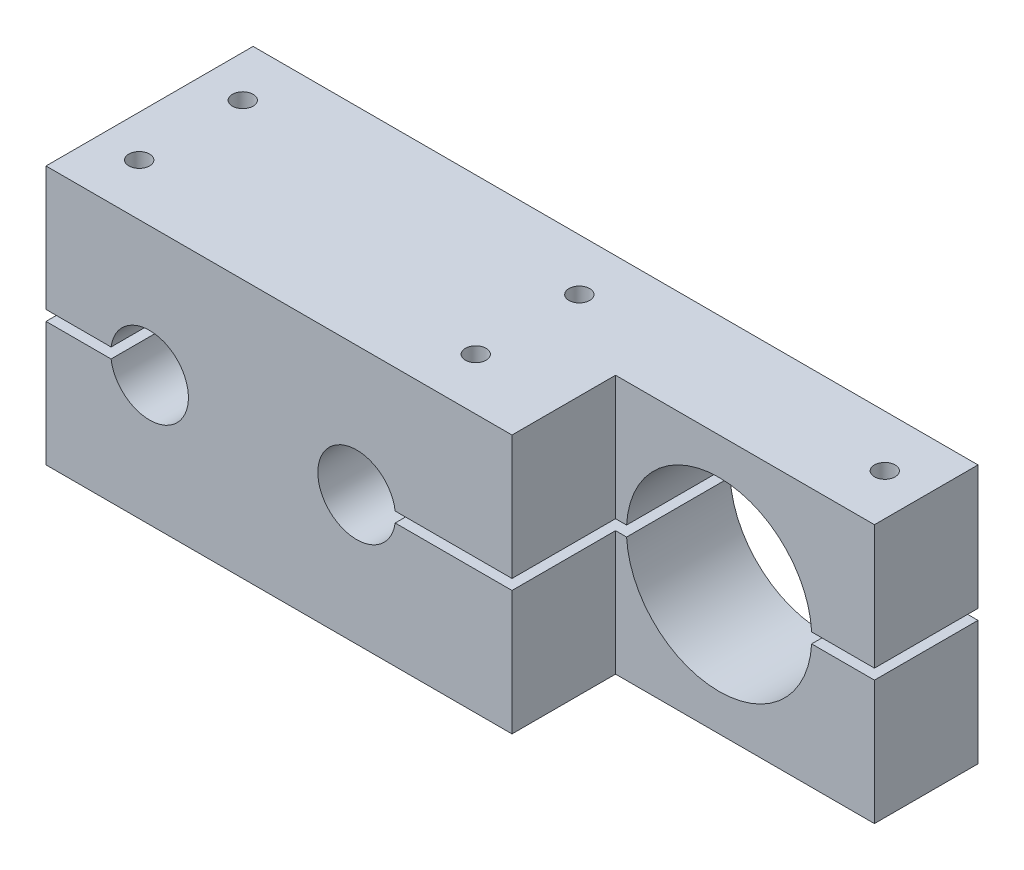
ISO-10303-21;
HEADER;
FILE_DESCRIPTION(('STEP AP214'),'2;1');
FILE_NAME('part.step','',(''),(''),'','','');
FILE_SCHEMA(('AUTOMOTIVE_DESIGN { 1 0 10303 214 1 1 1 1 }'));
ENDSEC;
DATA;
#1=APPLICATION_CONTEXT('core data for automotive mechanical design processes');
#2=APPLICATION_PROTOCOL_DEFINITION('international standard','automotive_design',2000,#1);
#3=PRODUCT_CONTEXT('',#1,'mechanical');
#4=PRODUCT('Part','Part','',(#3));
#5=PRODUCT_RELATED_PRODUCT_CATEGORY('part','',(#4));
#6=PRODUCT_DEFINITION_FORMATION('','',#4);
#7=PRODUCT_DEFINITION_CONTEXT('part definition',#1,'design');
#8=PRODUCT_DEFINITION('design','',#6,#7);
#9=PRODUCT_DEFINITION_SHAPE('','',#8);
#10=(LENGTH_UNIT() NAMED_UNIT(*) SI_UNIT(.MILLI.,.METRE.));
#11=(NAMED_UNIT(*) PLANE_ANGLE_UNIT() SI_UNIT($,.RADIAN.));
#12=(NAMED_UNIT(*) SI_UNIT($,.STERADIAN.) SOLID_ANGLE_UNIT());
#13=UNCERTAINTY_MEASURE_WITH_UNIT(LENGTH_MEASURE(1.E-05),#10,'distance_accuracy_value','');
#14=(GEOMETRIC_REPRESENTATION_CONTEXT(3) GLOBAL_UNCERTAINTY_ASSIGNED_CONTEXT((#13)) GLOBAL_UNIT_ASSIGNED_CONTEXT((#10,
#11,#12)) REPRESENTATION_CONTEXT('',''));
#15=CARTESIAN_POINT('',(0.,0.,0.));
#16=DIRECTION('',(0.,0.,1.));
#17=DIRECTION('',(1.,0.,0.));
#18=AXIS2_PLACEMENT_3D('',#15,#16,#17);
#19=CARTESIAN_POINT('',(0.,0.,40.));
#20=DIRECTION('',(0.,1.,0.));
#21=DIRECTION('',(0.,0.,1.));
#22=AXIS2_PLACEMENT_3D('',#19,#20,#21);
#23=PLANE('',#22);
#24=CARTESIAN_POINT('',(73.,0.,10.));
#25=DIRECTION('',(0.,-1.,0.));
#26=DIRECTION('',(0.,0.,-1.));
#27=AXIS2_PLACEMENT_3D('',#24,#25,#26);
#28=CIRCLE('',#27,2.);
#29=CARTESIAN_POINT('',(73.,0.,8.));
#30=VERTEX_POINT('',#29);
#31=EDGE_CURVE('E532',#30,#30,#28,.T.);
#32=ORIENTED_EDGE('',*,*,#31,.F.);
#33=EDGE_LOOP('',(#32));
#34=FACE_BOUND('',#33,.T.);
#35=CARTESIAN_POINT('',(132.,0.,10.));
#36=DIRECTION('',(0.,-1.,0.));
#37=DIRECTION('',(0.,0.,-1.));
#38=AXIS2_PLACEMENT_3D('',#35,#36,#37);
#39=CIRCLE('',#38,2.);
#40=CARTESIAN_POINT('',(132.,0.,8.00000000000001));
#41=VERTEX_POINT('',#40);
#42=EDGE_CURVE('E245',#41,#41,#39,.T.);
#43=ORIENTED_EDGE('',*,*,#42,.F.);
#44=EDGE_LOOP('',(#43));
#45=FACE_BOUND('',#44,.T.);
#46=CARTESIAN_POINT('',(73.,0.,30.));
#47=DIRECTION('',(0.,-1.,0.));
#48=DIRECTION('',(0.,0.,-1.));
#49=AXIS2_PLACEMENT_3D('',#46,#47,#48);
#50=CIRCLE('',#49,2.);
#51=CARTESIAN_POINT('',(73.,0.,28.));
#52=VERTEX_POINT('',#51);
#53=EDGE_CURVE('E234',#52,#52,#50,.T.);
#54=ORIENTED_EDGE('',*,*,#53,.F.);
#55=EDGE_LOOP('',(#54));
#56=FACE_BOUND('',#55,.T.);
#57=CARTESIAN_POINT('',(8.,0.,30.));
#58=DIRECTION('',(0.,-1.,0.));
#59=DIRECTION('',(0.,0.,-1.));
#60=AXIS2_PLACEMENT_3D('',#57,#58,#59);
#61=CIRCLE('',#60,2.);
#62=CARTESIAN_POINT('',(8.,0.,28.));
#63=VERTEX_POINT('',#62);
#64=EDGE_CURVE('E206',#63,#63,#61,.T.);
#65=ORIENTED_EDGE('',*,*,#64,.F.);
#66=EDGE_LOOP('',(#65));
#67=FACE_BOUND('',#66,.T.);
#68=CARTESIAN_POINT('',(8.,0.,10.));
#69=DIRECTION('',(0.,-1.,0.));
#70=DIRECTION('',(0.,0.,-1.));
#71=AXIS2_PLACEMENT_3D('',#68,#69,#70);
#72=CIRCLE('',#71,2.);
#73=CARTESIAN_POINT('',(8.,0.,8.));
#74=VERTEX_POINT('',#73);
#75=EDGE_CURVE('E210',#74,#74,#72,.T.);
#76=ORIENTED_EDGE('',*,*,#75,.F.);
#77=EDGE_LOOP('',(#76));
#78=FACE_BOUND('',#77,.T.);
#79=DIRECTION('',(-1.,0.,0.));
#80=VECTOR('',#79,1.);
#81=CARTESIAN_POINT('',(140.,0.,20.));
#82=LINE('',#81,#80);
#83=CARTESIAN_POINT('',(140.,0.,20.));
#84=VERTEX_POINT('',#83);
#85=CARTESIAN_POINT('',(90.,0.,20.));
#86=VERTEX_POINT('',#85);
#87=EDGE_CURVE('E172',#84,#86,#82,.T.);
#88=ORIENTED_EDGE('',*,*,#87,.T.);
#89=DIRECTION('',(0.,0.,1.));
#90=VECTOR('',#89,1.);
#91=CARTESIAN_POINT('',(90.,0.,20.));
#92=LINE('',#91,#90);
#93=CARTESIAN_POINT('',(90.,0.,40.));
#94=VERTEX_POINT('',#93);
#95=EDGE_CURVE('E182',#86,#94,#92,.T.);
#96=ORIENTED_EDGE('',*,*,#95,.T.);
#97=DIRECTION('',(1.,0.,0.));
#98=VECTOR('',#97,1.);
#99=CARTESIAN_POINT('',(0.,0.,40.));
#100=LINE('',#99,#98);
#101=CARTESIAN_POINT('',(0.,0.,40.));
#102=VERTEX_POINT('',#101);
#103=EDGE_CURVE('E261',#102,#94,#100,.T.);
#104=ORIENTED_EDGE('',*,*,#103,.F.);
#105=DIRECTION('',(0.,0.,-1.));
#106=VECTOR('',#105,1.);
#107=CARTESIAN_POINT('',(0.,0.,40.));
#108=LINE('',#107,#106);
#109=CARTESIAN_POINT('',(0.,0.,0.));
#110=VERTEX_POINT('',#109);
#111=EDGE_CURVE('E43',#102,#110,#108,.T.);
#112=ORIENTED_EDGE('',*,*,#111,.T.);
#113=DIRECTION('',(1.,0.,0.));
#114=VECTOR('',#113,1.);
#115=CARTESIAN_POINT('',(0.,0.,0.));
#116=LINE('',#115,#114);
#117=CARTESIAN_POINT('',(140.,0.,0.));
#118=VERTEX_POINT('',#117);
#119=EDGE_CURVE('E195',#110,#118,#116,.T.);
#120=ORIENTED_EDGE('',*,*,#119,.T.);
#121=DIRECTION('',(0.,0.,-1.));
#122=VECTOR('',#121,1.);
#123=CARTESIAN_POINT('',(140.,0.,40.));
#124=LINE('',#123,#122);
#125=EDGE_CURVE('E188',#84,#118,#124,.T.);
#126=ORIENTED_EDGE('',*,*,#125,.F.);
#127=EDGE_LOOP('',(#88,#96,#104,#112,#120,#126));
#128=FACE_BOUND('',#127,.T.);
#129=ADVANCED_FACE('F35',(#34,#45,#56,#67,#78,#128),#23,.F.);
#130=CARTESIAN_POINT('',(140.,23.9990958261087,40.));
#131=DIRECTION('',(-1.,0.,0.));
#132=DIRECTION('',(0.,0.,1.));
#133=AXIS2_PLACEMENT_3D('',#130,#131,#132);
#134=PLANE('',#133);
#135=DIRECTION('',(0.,-1.,0.));
#136=VECTOR('',#135,1.);
#137=CARTESIAN_POINT('',(140.,50.,20.));
#138=LINE('',#137,#136);
#139=CARTESIAN_POINT('',(140.,23.9990958261087,20.));
#140=VERTEX_POINT('',#139);
#141=EDGE_CURVE('E175',#140,#84,#138,.T.);
#142=ORIENTED_EDGE('',*,*,#141,.T.);
#143=ORIENTED_EDGE('',*,*,#125,.T.);
#144=DIRECTION('',(0.,1.,0.));
#145=VECTOR('',#144,1.);
#146=CARTESIAN_POINT('',(140.,23.9990958261087,0.));
#147=LINE('',#146,#145);
#148=CARTESIAN_POINT('',(140.,23.9990958261087,0.));
#149=VERTEX_POINT('',#148);
#150=EDGE_CURVE('E286',#118,#149,#147,.T.);
#151=ORIENTED_EDGE('',*,*,#150,.T.);
#152=DIRECTION('',(0.,0.,-1.));
#153=VECTOR('',#152,1.);
#154=CARTESIAN_POINT('',(140.,23.9990958261087,40.));
#155=LINE('',#154,#153);
#156=EDGE_CURVE('E190',#140,#149,#155,.T.);
#157=ORIENTED_EDGE('',*,*,#156,.F.);
#158=EDGE_LOOP('',(#142,#143,#151,#157));
#159=FACE_BOUND('',#158,.T.);
#160=ADVANCED_FACE('F186',(#159),#134,.F.);
#161=CARTESIAN_POINT('',(127.871994595867,23.9990958261087,40.));
#162=DIRECTION('',(0.,-1.,0.));
#163=DIRECTION('',(1.,0.,0.));
#164=AXIS2_PLACEMENT_3D('',#161,#162,#163);
#165=PLANE('',#164);
#166=CARTESIAN_POINT('',(132.,23.9990958261087,10.));
#167=DIRECTION('',(0.,-1.,0.));
#168=DIRECTION('',(1.,0.,0.));
#169=AXIS2_PLACEMENT_3D('',#166,#167,#168);
#170=CIRCLE('',#169,2.);
#171=CARTESIAN_POINT('',(134.,23.9990958261087,10.));
#172=VERTEX_POINT('',#171);
#173=EDGE_CURVE('E254',#172,#172,#170,.T.);
#174=ORIENTED_EDGE('',*,*,#173,.T.);
#175=EDGE_LOOP('',(#174));
#176=FACE_BOUND('',#175,.T.);
#177=DIRECTION('',(-1.,0.,0.));
#178=VECTOR('',#177,1.);
#179=CARTESIAN_POINT('',(127.871994595867,23.9990958261087,20.));
#180=LINE('',#179,#178);
#181=CARTESIAN_POINT('',(127.871994595867,23.9990958261087,20.));
#182=VERTEX_POINT('',#181);
#183=EDGE_CURVE('E222',#140,#182,#180,.T.);
#184=ORIENTED_EDGE('',*,*,#183,.F.);
#185=ORIENTED_EDGE('',*,*,#156,.T.);
#186=DIRECTION('',(-1.,0.,0.));
#187=VECTOR('',#186,1.);
#188=CARTESIAN_POINT('',(127.871994595867,23.9990958261087,0.));
#189=LINE('',#188,#187);
#190=CARTESIAN_POINT('',(127.871994595867,23.9990958261087,0.));
#191=VERTEX_POINT('',#190);
#192=EDGE_CURVE('E288',#149,#191,#189,.T.);
#193=ORIENTED_EDGE('',*,*,#192,.T.);
#194=DIRECTION('',(0.,0.,-1.));
#195=VECTOR('',#194,1.);
#196=CARTESIAN_POINT('',(127.871994595867,23.9990958261087,40.));
#197=LINE('',#196,#195);
#198=EDGE_CURVE('E199',#182,#191,#197,.T.);
#199=ORIENTED_EDGE('',*,*,#198,.F.);
#200=EDGE_LOOP('',(#184,#185,#193,#199));
#201=FACE_BOUND('',#200,.T.);
#202=ADVANCED_FACE('F358',(#176,#201),#165,.F.);
#203=CARTESIAN_POINT('',(110.,25.,40.));
#204=DIRECTION('',(0.,0.,-1.));
#205=DIRECTION('',(-1.,0.,0.));
#206=AXIS2_PLACEMENT_3D('',#203,#204,#205);
#207=CYLINDRICAL_SURFACE('',#206,17.9);
#208=CARTESIAN_POINT('',(110.,25.,20.));
#209=DIRECTION('',(0.,0.,1.));
#210=DIRECTION('',(1.,0.,0.));
#211=AXIS2_PLACEMENT_3D('',#208,#209,#210);
#212=CIRCLE('',#211,17.9);
#213=CARTESIAN_POINT('',(92.1280054041333,23.9990958261087,20.));
#214=VERTEX_POINT('',#213);
#215=EDGE_CURVE('E355',#182,#214,#212,.F.);
#216=ORIENTED_EDGE('',*,*,#215,.F.);
#217=ORIENTED_EDGE('',*,*,#198,.T.);
#218=CARTESIAN_POINT('',(110.,25.,0.));
#219=DIRECTION('',(0.,0.,-1.));
#220=DIRECTION('',(1.,0.,0.));
#221=AXIS2_PLACEMENT_3D('',#218,#219,#220);
#222=CIRCLE('',#221,17.9);
#223=CARTESIAN_POINT('',(92.1280054041333,23.9990958261087,0.));
#224=VERTEX_POINT('',#223);
#225=EDGE_CURVE('E291',#191,#224,#222,.T.);
#226=ORIENTED_EDGE('',*,*,#225,.T.);
#227=DIRECTION('',(0.,0.,-1.));
#228=VECTOR('',#227,1.);
#229=CARTESIAN_POINT('',(92.1280054041333,23.9990958261087,40.));
#230=LINE('',#229,#228);
#231=EDGE_CURVE('E347',#214,#224,#230,.T.);
#232=ORIENTED_EDGE('',*,*,#231,.F.);
#233=EDGE_LOOP('',(#216,#217,#226,#232));
#234=FACE_BOUND('',#233,.T.);
#235=ADVANCED_FACE('F351',(#234),#207,.F.);
#236=CARTESIAN_POINT('',(67.4329126750344,23.9990958261087,40.));
#237=DIRECTION('',(0.,-1.,0.));
#238=DIRECTION('',(1.,0.,0.));
#239=AXIS2_PLACEMENT_3D('',#236,#237,#238);
#240=PLANE('',#239);
#241=CARTESIAN_POINT('',(73.,23.9990958261087,10.));
#242=DIRECTION('',(0.,-1.,0.));
#243=DIRECTION('',(1.,0.,0.));
#244=AXIS2_PLACEMENT_3D('',#241,#242,#243);
#245=CIRCLE('',#244,2.);
#246=CARTESIAN_POINT('',(75.,23.9990958261087,10.));
#247=VERTEX_POINT('',#246);
#248=EDGE_CURVE('E192',#247,#247,#245,.T.);
#249=ORIENTED_EDGE('',*,*,#248,.T.);
#250=EDGE_LOOP('',(#249));
#251=FACE_BOUND('',#250,.T.);
#252=CARTESIAN_POINT('',(73.,23.9990958261087,30.));
#253=DIRECTION('',(0.,-1.,0.));
#254=DIRECTION('',(1.,0.,0.));
#255=AXIS2_PLACEMENT_3D('',#252,#253,#254);
#256=CIRCLE('',#255,2.);
#257=CARTESIAN_POINT('',(75.,23.9990958261087,30.));
#258=VERTEX_POINT('',#257);
#259=EDGE_CURVE('E242',#258,#258,#256,.T.);
#260=ORIENTED_EDGE('',*,*,#259,.T.);
#261=EDGE_LOOP('',(#260));
#262=FACE_BOUND('',#261,.T.);
#263=DIRECTION('',(-1.,0.,0.));
#264=VECTOR('',#263,1.);
#265=CARTESIAN_POINT('',(67.4329126750344,23.9990958261087,20.));
#266=LINE('',#265,#264);
#267=CARTESIAN_POINT('',(90.,23.9990958261087,20.));
#268=VERTEX_POINT('',#267);
#269=EDGE_CURVE('E376',#214,#268,#266,.T.);
#270=ORIENTED_EDGE('',*,*,#269,.F.);
#271=ORIENTED_EDGE('',*,*,#231,.T.);
#272=DIRECTION('',(-1.,0.,0.));
#273=VECTOR('',#272,1.);
#274=CARTESIAN_POINT('',(67.4329126750344,23.9990958261087,0.));
#275=LINE('',#274,#273);
#276=CARTESIAN_POINT('',(67.4329126750344,23.9990958261087,0.));
#277=VERTEX_POINT('',#276);
#278=EDGE_CURVE('E294',#224,#277,#275,.T.);
#279=ORIENTED_EDGE('',*,*,#278,.T.);
#280=DIRECTION('',(0.,0.,-1.));
#281=VECTOR('',#280,1.);
#282=CARTESIAN_POINT('',(67.4329126750344,23.9990958261087,40.));
#283=LINE('',#282,#281);
#284=CARTESIAN_POINT('',(67.4329126750344,23.9990958261087,40.));
#285=VERTEX_POINT('',#284);
#286=EDGE_CURVE('E344',#285,#277,#283,.T.);
#287=ORIENTED_EDGE('',*,*,#286,.F.);
#288=DIRECTION('',(-1.,0.,0.));
#289=VECTOR('',#288,1.);
#290=CARTESIAN_POINT('',(67.4329126750344,23.9990958261087,40.));
#291=LINE('',#290,#289);
#292=CARTESIAN_POINT('',(90.,23.9990958261087,40.));
#293=VERTEX_POINT('',#292);
#294=EDGE_CURVE('E265',#293,#285,#291,.T.);
#295=ORIENTED_EDGE('',*,*,#294,.F.);
#296=DIRECTION('',(0.,0.,1.));
#297=VECTOR('',#296,1.);
#298=CARTESIAN_POINT('',(90.,23.9990958261087,40.));
#299=LINE('',#298,#297);
#300=EDGE_CURVE('E58',#268,#293,#299,.T.);
#301=ORIENTED_EDGE('',*,*,#300,.F.);
#302=EDGE_LOOP('',(#270,#271,#279,#287,#295,#301));
#303=FACE_BOUND('',#302,.T.);
#304=ADVANCED_FACE('F367',(#251,#262,#303),#240,.F.);
#305=CARTESIAN_POINT('',(67.4329126750344,26.0009041738913,40.));
#306=DIRECTION('',(0.,1.,0.));
#307=DIRECTION('',(-1.,0.,0.));
#308=AXIS2_PLACEMENT_3D('',#305,#306,#307);
#309=PLANE('',#308);
#310=CARTESIAN_POINT('',(73.,26.0009041738913,10.));
#311=DIRECTION('',(0.,1.,0.));
#312=DIRECTION('',(-1.,0.,0.));
#313=AXIS2_PLACEMENT_3D('',#310,#311,#312);
#314=CIRCLE('',#313,2.);
#315=CARTESIAN_POINT('',(71.,26.0009041738913,10.));
#316=VERTEX_POINT('',#315);
#317=EDGE_CURVE('E535',#316,#316,#314,.T.);
#318=ORIENTED_EDGE('',*,*,#317,.T.);
#319=EDGE_LOOP('',(#318));
#320=FACE_BOUND('',#319,.T.);
#321=CARTESIAN_POINT('',(73.,26.0009041738913,30.));
#322=DIRECTION('',(0.,1.,0.));
#323=DIRECTION('',(-1.,0.,0.));
#324=AXIS2_PLACEMENT_3D('',#321,#322,#323);
#325=CIRCLE('',#324,2.);
#326=CARTESIAN_POINT('',(71.,26.0009041738913,30.));
#327=VERTEX_POINT('',#326);
#328=EDGE_CURVE('E237',#327,#327,#325,.T.);
#329=ORIENTED_EDGE('',*,*,#328,.T.);
#330=EDGE_LOOP('',(#329));
#331=FACE_BOUND('',#330,.T.);
#332=DIRECTION('',(1.,0.,0.));
#333=VECTOR('',#332,1.);
#334=CARTESIAN_POINT('',(67.4329126750344,26.0009041738913,20.));
#335=LINE('',#334,#333);
#336=CARTESIAN_POINT('',(90.,26.0009041738913,20.));
#337=VERTEX_POINT('',#336);
#338=CARTESIAN_POINT('',(92.1280054041333,26.0009041738913,20.));
#339=VERTEX_POINT('',#338);
#340=EDGE_CURVE('E386',#337,#339,#335,.T.);
#341=ORIENTED_EDGE('',*,*,#340,.F.);
#342=DIRECTION('',(0.,0.,-1.));
#343=VECTOR('',#342,1.);
#344=CARTESIAN_POINT('',(90.,26.0009041738913,40.));
#345=LINE('',#344,#343);
#346=CARTESIAN_POINT('',(90.,26.0009041738913,40.));
#347=VERTEX_POINT('',#346);
#348=EDGE_CURVE('E378',#347,#337,#345,.T.);
#349=ORIENTED_EDGE('',*,*,#348,.F.);
#350=DIRECTION('',(1.,0.,0.));
#351=VECTOR('',#350,1.);
#352=CARTESIAN_POINT('',(67.4329126750344,26.0009041738913,40.));
#353=LINE('',#352,#351);
#354=CARTESIAN_POINT('',(67.4329126750344,26.0009041738913,40.));
#355=VERTEX_POINT('',#354);
#356=EDGE_CURVE('E269',#355,#347,#353,.T.);
#357=ORIENTED_EDGE('',*,*,#356,.F.);
#358=DIRECTION('',(0.,0.,-1.));
#359=VECTOR('',#358,1.);
#360=CARTESIAN_POINT('',(67.4329126750344,26.0009041738913,40.));
#361=LINE('',#360,#359);
#362=CARTESIAN_POINT('',(67.4329126750344,26.0009041738913,0.));
#363=VERTEX_POINT('',#362);
#364=EDGE_CURVE('E341',#355,#363,#361,.T.);
#365=ORIENTED_EDGE('',*,*,#364,.T.);
#366=DIRECTION('',(1.,0.,0.));
#367=VECTOR('',#366,1.);
#368=CARTESIAN_POINT('',(67.4329126750344,26.0009041738913,0.));
#369=LINE('',#368,#367);
#370=CARTESIAN_POINT('',(92.1280054041333,26.0009041738913,0.));
#371=VERTEX_POINT('',#370);
#372=EDGE_CURVE('E298',#363,#371,#369,.T.);
#373=ORIENTED_EDGE('',*,*,#372,.T.);
#374=DIRECTION('',(0.,0.,-1.));
#375=VECTOR('',#374,1.);
#376=CARTESIAN_POINT('',(92.1280054041333,26.0009041738913,40.));
#377=LINE('',#376,#375);
#378=EDGE_CURVE('E339',#339,#371,#377,.T.);
#379=ORIENTED_EDGE('',*,*,#378,.F.);
#380=EDGE_LOOP('',(#341,#349,#357,#365,#373,#379));
#381=FACE_BOUND('',#380,.T.);
#382=ADVANCED_FACE('F406',(#320,#331,#381),#309,.F.);
#383=CARTESIAN_POINT('',(110.,25.,40.));
#384=DIRECTION('',(0.,0.,-1.));
#385=DIRECTION('',(-1.,0.,0.));
#386=AXIS2_PLACEMENT_3D('',#383,#384,#385);
#387=CYLINDRICAL_SURFACE('',#386,17.9);
#388=CARTESIAN_POINT('',(110.,25.,20.));
#389=DIRECTION('',(0.,0.,1.));
#390=DIRECTION('',(1.,0.,0.));
#391=AXIS2_PLACEMENT_3D('',#388,#389,#390);
#392=CIRCLE('',#391,17.9);
#393=CARTESIAN_POINT('',(127.871994595867,26.0009041738913,20.));
#394=VERTEX_POINT('',#393);
#395=EDGE_CURVE('E380',#339,#394,#392,.F.);
#396=ORIENTED_EDGE('',*,*,#395,.F.);
#397=ORIENTED_EDGE('',*,*,#378,.T.);
#398=CARTESIAN_POINT('',(110.,25.,0.));
#399=DIRECTION('',(0.,0.,-1.));
#400=DIRECTION('',(1.,0.,0.));
#401=AXIS2_PLACEMENT_3D('',#398,#399,#400);
#402=CIRCLE('',#401,17.9);
#403=CARTESIAN_POINT('',(127.871994595867,26.0009041738913,0.));
#404=VERTEX_POINT('',#403);
#405=EDGE_CURVE('E301',#371,#404,#402,.T.);
#406=ORIENTED_EDGE('',*,*,#405,.T.);
#407=DIRECTION('',(0.,0.,-1.));
#408=VECTOR('',#407,1.);
#409=CARTESIAN_POINT('',(127.871994595867,26.0009041738913,40.));
#410=LINE('',#409,#408);
#411=EDGE_CURVE('E337',#394,#404,#410,.T.);
#412=ORIENTED_EDGE('',*,*,#411,.F.);
#413=EDGE_LOOP('',(#396,#397,#406,#412));
#414=FACE_BOUND('',#413,.T.);
#415=ADVANCED_FACE('F413',(#414),#387,.F.);
#416=CARTESIAN_POINT('',(127.871994595867,26.0009041738913,40.));
#417=DIRECTION('',(0.,1.,0.));
#418=DIRECTION('',(-1.,0.,0.));
#419=AXIS2_PLACEMENT_3D('',#416,#417,#418);
#420=PLANE('',#419);
#421=CARTESIAN_POINT('',(132.,26.0009041738913,10.));
#422=DIRECTION('',(0.,1.,0.));
#423=DIRECTION('',(-1.,0.,0.));
#424=AXIS2_PLACEMENT_3D('',#421,#422,#423);
#425=CIRCLE('',#424,2.);
#426=CARTESIAN_POINT('',(130.,26.0009041738913,10.));
#427=VERTEX_POINT('',#426);
#428=EDGE_CURVE('E249',#427,#427,#425,.T.);
#429=ORIENTED_EDGE('',*,*,#428,.T.);
#430=EDGE_LOOP('',(#429));
#431=FACE_BOUND('',#430,.T.);
#432=DIRECTION('',(1.,0.,0.));
#433=VECTOR('',#432,1.);
#434=CARTESIAN_POINT('',(127.871994595867,26.0009041738913,20.));
#435=LINE('',#434,#433);
#436=CARTESIAN_POINT('',(140.,26.0009041738913,20.));
#437=VERTEX_POINT('',#436);
#438=EDGE_CURVE('E377',#394,#437,#435,.T.);
#439=ORIENTED_EDGE('',*,*,#438,.F.);
#440=ORIENTED_EDGE('',*,*,#411,.T.);
#441=DIRECTION('',(1.,0.,0.));
#442=VECTOR('',#441,1.);
#443=CARTESIAN_POINT('',(127.871994595867,26.0009041738913,0.));
#444=LINE('',#443,#442);
#445=CARTESIAN_POINT('',(140.,26.0009041738913,0.));
#446=VERTEX_POINT('',#445);
#447=EDGE_CURVE('E304',#404,#446,#444,.T.);
#448=ORIENTED_EDGE('',*,*,#447,.T.);
#449=DIRECTION('',(0.,0.,-1.));
#450=VECTOR('',#449,1.);
#451=CARTESIAN_POINT('',(140.,26.0009041738913,40.));
#452=LINE('',#451,#450);
#453=EDGE_CURVE('E335',#437,#446,#452,.T.);
#454=ORIENTED_EDGE('',*,*,#453,.F.);
#455=EDGE_LOOP('',(#439,#440,#448,#454));
#456=FACE_BOUND('',#455,.T.);
#457=ADVANCED_FACE('F417',(#431,#456),#420,.F.);
#458=CARTESIAN_POINT('',(140.,50.,40.));
#459=DIRECTION('',(-1.,0.,0.));
#460=DIRECTION('',(0.,0.,1.));
#461=AXIS2_PLACEMENT_3D('',#458,#459,#460);
#462=PLANE('',#461);
#463=CARTESIAN_POINT('',(140.,50.,20.));
#464=VERTEX_POINT('',#463);
#465=EDGE_CURVE('E191',#464,#437,#138,.T.);
#466=ORIENTED_EDGE('',*,*,#465,.T.);
#467=ORIENTED_EDGE('',*,*,#453,.T.);
#468=DIRECTION('',(0.,1.,0.));
#469=VECTOR('',#468,1.);
#470=CARTESIAN_POINT('',(140.,50.,0.));
#471=LINE('',#470,#469);
#472=CARTESIAN_POINT('',(140.,50.,0.));
#473=VERTEX_POINT('',#472);
#474=EDGE_CURVE('E307',#446,#473,#471,.T.);
#475=ORIENTED_EDGE('',*,*,#474,.T.);
#476=DIRECTION('',(0.,0.,-1.));
#477=VECTOR('',#476,1.);
#478=CARTESIAN_POINT('',(140.,50.,40.));
#479=LINE('',#478,#477);
#480=EDGE_CURVE('E333',#464,#473,#479,.T.);
#481=ORIENTED_EDGE('',*,*,#480,.F.);
#482=EDGE_LOOP('',(#466,#467,#475,#481));
#483=FACE_BOUND('',#482,.T.);
#484=ADVANCED_FACE('F422',(#483),#462,.F.);
#485=CARTESIAN_POINT('',(0.,50.,40.));
#486=DIRECTION('',(0.,-1.,0.));
#487=DIRECTION('',(0.,0.,-1.));
#488=AXIS2_PLACEMENT_3D('',#485,#486,#487);
#489=PLANE('',#488);
#490=CARTESIAN_POINT('',(73.,50.,10.));
#491=DIRECTION('',(0.,-1.,0.));
#492=DIRECTION('',(0.,0.,-1.));
#493=AXIS2_PLACEMENT_3D('',#490,#491,#492);
#494=CIRCLE('',#493,2.);
#495=CARTESIAN_POINT('',(73.,50.,8.));
#496=VERTEX_POINT('',#495);
#497=EDGE_CURVE('E539',#496,#496,#494,.T.);
#498=ORIENTED_EDGE('',*,*,#497,.T.);
#499=EDGE_LOOP('',(#498));
#500=FACE_BOUND('',#499,.T.);
#501=CARTESIAN_POINT('',(132.,50.,10.));
#502=DIRECTION('',(0.,-1.,0.));
#503=DIRECTION('',(0.,0.,-1.));
#504=AXIS2_PLACEMENT_3D('',#501,#502,#503);
#505=CIRCLE('',#504,2.);
#506=CARTESIAN_POINT('',(132.,50.,8.00000000000001));
#507=VERTEX_POINT('',#506);
#508=EDGE_CURVE('E246',#507,#507,#505,.T.);
#509=ORIENTED_EDGE('',*,*,#508,.T.);
#510=EDGE_LOOP('',(#509));
#511=FACE_BOUND('',#510,.T.);
#512=CARTESIAN_POINT('',(73.,50.,30.));
#513=DIRECTION('',(0.,-1.,0.));
#514=DIRECTION('',(0.,0.,-1.));
#515=AXIS2_PLACEMENT_3D('',#512,#513,#514);
#516=CIRCLE('',#515,2.);
#517=CARTESIAN_POINT('',(73.,50.,28.));
#518=VERTEX_POINT('',#517);
#519=EDGE_CURVE('E233',#518,#518,#516,.T.);
#520=ORIENTED_EDGE('',*,*,#519,.T.);
#521=EDGE_LOOP('',(#520));
#522=FACE_BOUND('',#521,.T.);
#523=CARTESIAN_POINT('',(8.,50.,30.));
#524=DIRECTION('',(0.,-1.,0.));
#525=DIRECTION('',(0.,0.,-1.));
#526=AXIS2_PLACEMENT_3D('',#523,#524,#525);
#527=CIRCLE('',#526,2.);
#528=CARTESIAN_POINT('',(8.,50.,28.));
#529=VERTEX_POINT('',#528);
#530=EDGE_CURVE('E214',#529,#529,#527,.T.);
#531=ORIENTED_EDGE('',*,*,#530,.T.);
#532=EDGE_LOOP('',(#531));
#533=FACE_BOUND('',#532,.T.);
#534=CARTESIAN_POINT('',(8.,50.,10.));
#535=DIRECTION('',(0.,-1.,0.));
#536=DIRECTION('',(0.,0.,-1.));
#537=AXIS2_PLACEMENT_3D('',#534,#535,#536);
#538=CIRCLE('',#537,2.);
#539=CARTESIAN_POINT('',(8.,50.,8.));
#540=VERTEX_POINT('',#539);
#541=EDGE_CURVE('E217',#540,#540,#538,.T.);
#542=ORIENTED_EDGE('',*,*,#541,.T.);
#543=EDGE_LOOP('',(#542));
#544=FACE_BOUND('',#543,.T.);
#545=DIRECTION('',(-1.,0.,0.));
#546=VECTOR('',#545,1.);
#547=CARTESIAN_POINT('',(140.,50.,20.));
#548=LINE('',#547,#546);
#549=CARTESIAN_POINT('',(90.,50.,20.));
#550=VERTEX_POINT('',#549);
#551=EDGE_CURVE('E398',#464,#550,#548,.T.);
#552=ORIENTED_EDGE('',*,*,#551,.F.);
#553=ORIENTED_EDGE('',*,*,#480,.T.);
#554=DIRECTION('',(-1.,0.,0.));
#555=VECTOR('',#554,1.);
#556=CARTESIAN_POINT('',(0.,50.,0.));
#557=LINE('',#556,#555);
#558=CARTESIAN_POINT('',(0.,50.,0.));
#559=VERTEX_POINT('',#558);
#560=EDGE_CURVE('E310',#473,#559,#557,.T.);
#561=ORIENTED_EDGE('',*,*,#560,.T.);
#562=DIRECTION('',(0.,0.,-1.));
#563=VECTOR('',#562,1.);
#564=CARTESIAN_POINT('',(0.,50.,40.));
#565=LINE('',#564,#563);
#566=CARTESIAN_POINT('',(0.,50.,40.));
#567=VERTEX_POINT('',#566);
#568=EDGE_CURVE('E330',#567,#559,#565,.T.);
#569=ORIENTED_EDGE('',*,*,#568,.F.);
#570=DIRECTION('',(-1.,0.,0.));
#571=VECTOR('',#570,1.);
#572=CARTESIAN_POINT('',(0.,50.,40.));
#573=LINE('',#572,#571);
#574=CARTESIAN_POINT('',(90.,50.,40.));
#575=VERTEX_POINT('',#574);
#576=EDGE_CURVE('E272',#575,#567,#573,.T.);
#577=ORIENTED_EDGE('',*,*,#576,.F.);
#578=DIRECTION('',(0.,0.,1.));
#579=VECTOR('',#578,1.);
#580=CARTESIAN_POINT('',(90.,50.,20.));
#581=LINE('',#580,#579);
#582=EDGE_CURVE('E50',#550,#575,#581,.T.);
#583=ORIENTED_EDGE('',*,*,#582,.F.);
#584=EDGE_LOOP('',(#552,#553,#561,#569,#577,#583));
#585=FACE_BOUND('',#584,.T.);
#586=ADVANCED_FACE('F425',(#500,#511,#522,#533,#544,#585),#489,.F.);
#587=CARTESIAN_POINT('',(20.,25.,40.));
#588=DIRECTION('',(0.,0.,1.));
#589=DIRECTION('',(1.,0.,0.));
#590=AXIS2_PLACEMENT_3D('',#587,#588,#589);
#591=PLANE('',#590);
#592=ORIENTED_EDGE('',*,*,#103,.T.);
#593=DIRECTION('',(0.,1.,0.));
#594=VECTOR('',#593,1.);
#595=CARTESIAN_POINT('',(90.,25.,40.));
#596=LINE('',#595,#594);
#597=EDGE_CURVE('E11',#94,#293,#596,.T.);
#598=ORIENTED_EDGE('',*,*,#597,.T.);
#599=ORIENTED_EDGE('',*,*,#294,.T.);
#600=CARTESIAN_POINT('',(60.,25.,40.));
#601=DIRECTION('',(0.,0.,-1.));
#602=DIRECTION('',(1.,0.,0.));
#603=AXIS2_PLACEMENT_3D('',#600,#601,#602);
#604=CIRCLE('',#603,7.5);
#605=EDGE_CURVE('E267',#285,#355,#604,.T.);
#606=ORIENTED_EDGE('',*,*,#605,.T.);
#607=ORIENTED_EDGE('',*,*,#356,.T.);
#608=DIRECTION('',(0.,-1.,0.));
#609=VECTOR('',#608,1.);
#610=CARTESIAN_POINT('',(90.,50.,40.));
#611=LINE('',#610,#609);
#612=EDGE_CURVE('E392',#575,#347,#611,.T.);
#613=ORIENTED_EDGE('',*,*,#612,.F.);
#614=ORIENTED_EDGE('',*,*,#576,.T.);
#615=DIRECTION('',(0.,-1.,0.));
#616=VECTOR('',#615,1.);
#617=CARTESIAN_POINT('',(0.,26.,40.));
#618=LINE('',#617,#616);
#619=CARTESIAN_POINT('',(0.,26.,40.));
#620=VERTEX_POINT('',#619);
#621=EDGE_CURVE('E274',#567,#620,#618,.T.);
#622=ORIENTED_EDGE('',*,*,#621,.T.);
#623=DIRECTION('',(1.,0.,0.));
#624=VECTOR('',#623,1.);
#625=CARTESIAN_POINT('',(0.,26.,40.));
#626=LINE('',#625,#624);
#627=CARTESIAN_POINT('',(12.5669656263407,26.,40.));
#628=VERTEX_POINT('',#627);
#629=EDGE_CURVE('E276',#620,#628,#626,.T.);
#630=ORIENTED_EDGE('',*,*,#629,.T.);
#631=CARTESIAN_POINT('',(20.,25.,40.));
#632=DIRECTION('',(0.,0.,-1.));
#633=DIRECTION('',(1.,0.,0.));
#634=AXIS2_PLACEMENT_3D('',#631,#632,#633);
#635=CIRCLE('',#634,7.5);
#636=CARTESIAN_POINT('',(12.5669656263407,24.,40.));
#637=VERTEX_POINT('',#636);
#638=EDGE_CURVE('E278',#628,#637,#635,.T.);
#639=ORIENTED_EDGE('',*,*,#638,.T.);
#640=DIRECTION('',(-1.,0.,0.));
#641=VECTOR('',#640,1.);
#642=CARTESIAN_POINT('',(0.,24.,40.));
#643=LINE('',#642,#641);
#644=CARTESIAN_POINT('',(0.,24.,40.));
#645=VERTEX_POINT('',#644);
#646=EDGE_CURVE('E280',#637,#645,#643,.T.);
#647=ORIENTED_EDGE('',*,*,#646,.T.);
#648=DIRECTION('',(0.,-1.,0.));
#649=VECTOR('',#648,1.);
#650=CARTESIAN_POINT('',(0.,0.,40.));
#651=LINE('',#650,#649);
#652=EDGE_CURVE('E258',#645,#102,#651,.T.);
#653=ORIENTED_EDGE('',*,*,#652,.T.);
#654=EDGE_LOOP('',(#592,#598,#599,#606,#607,#613,#614,#622,#630,#639,#647,#653));
#655=FACE_BOUND('',#654,.T.);
#656=ADVANCED_FACE('F375',(#655),#591,.T.);
#657=CARTESIAN_POINT('',(0.,0.,40.));
#658=DIRECTION('',(1.,0.,0.));
#659=DIRECTION('',(0.,1.,0.));
#660=AXIS2_PLACEMENT_3D('',#657,#658,#659);
#661=PLANE('',#660);
#662=DIRECTION('',(0.,-1.,0.));
#663=VECTOR('',#662,1.);
#664=CARTESIAN_POINT('',(0.,0.,0.));
#665=LINE('',#664,#663);
#666=CARTESIAN_POINT('',(0.,24.,0.));
#667=VERTEX_POINT('',#666);
#668=EDGE_CURVE('E257',#667,#110,#665,.T.);
#669=ORIENTED_EDGE('',*,*,#668,.T.);
#670=ORIENTED_EDGE('',*,*,#111,.F.);
#671=ORIENTED_EDGE('',*,*,#652,.F.);
#672=DIRECTION('',(0.,0.,-1.));
#673=VECTOR('',#672,1.);
#674=CARTESIAN_POINT('',(0.,24.,40.));
#675=LINE('',#674,#673);
#676=EDGE_CURVE('E282',#645,#667,#675,.T.);
#677=ORIENTED_EDGE('',*,*,#676,.T.);
#678=EDGE_LOOP('',(#669,#670,#671,#677));
#679=FACE_BOUND('',#678,.T.);
#680=ADVANCED_FACE('F37',(#679),#661,.F.);
#681=CARTESIAN_POINT('',(60.,25.,40.));
#682=DIRECTION('',(0.,0.,-1.));
#683=DIRECTION('',(-1.,0.,0.));
#684=AXIS2_PLACEMENT_3D('',#681,#682,#683);
#685=CYLINDRICAL_SURFACE('',#684,7.5);
#686=CARTESIAN_POINT('',(60.,25.,0.));
#687=DIRECTION('',(0.,0.,-1.));
#688=DIRECTION('',(1.,0.,0.));
#689=AXIS2_PLACEMENT_3D('',#686,#687,#688);
#690=CIRCLE('',#689,7.5);
#691=EDGE_CURVE('E296',#277,#363,#690,.T.);
#692=ORIENTED_EDGE('',*,*,#691,.T.);
#693=ORIENTED_EDGE('',*,*,#364,.F.);
#694=ORIENTED_EDGE('',*,*,#605,.F.);
#695=ORIENTED_EDGE('',*,*,#286,.T.);
#696=EDGE_LOOP('',(#692,#693,#694,#695));
#697=FACE_BOUND('',#696,.T.);
#698=ADVANCED_FACE('F371',(#697),#685,.F.);
#699=CARTESIAN_POINT('',(0.,26.,40.));
#700=DIRECTION('',(1.,0.,0.));
#701=DIRECTION('',(0.,0.,-1.));
#702=AXIS2_PLACEMENT_3D('',#699,#700,#701);
#703=PLANE('',#702);
#704=DIRECTION('',(0.,-1.,0.));
#705=VECTOR('',#704,1.);
#706=CARTESIAN_POINT('',(0.,26.,0.));
#707=LINE('',#706,#705);
#708=CARTESIAN_POINT('',(0.,26.,0.));
#709=VERTEX_POINT('',#708);
#710=EDGE_CURVE('E312',#559,#709,#707,.T.);
#711=ORIENTED_EDGE('',*,*,#710,.T.);
#712=DIRECTION('',(0.,0.,-1.));
#713=VECTOR('',#712,1.);
#714=CARTESIAN_POINT('',(0.,26.,40.));
#715=LINE('',#714,#713);
#716=EDGE_CURVE('E327',#620,#709,#715,.T.);
#717=ORIENTED_EDGE('',*,*,#716,.F.);
#718=ORIENTED_EDGE('',*,*,#621,.F.);
#719=ORIENTED_EDGE('',*,*,#568,.T.);
#720=EDGE_LOOP('',(#711,#717,#718,#719));
#721=FACE_BOUND('',#720,.T.);
#722=ADVANCED_FACE('F432',(#721),#703,.F.);
#723=CARTESIAN_POINT('',(0.,26.,40.));
#724=DIRECTION('',(0.,1.,0.));
#725=DIRECTION('',(0.,0.,1.));
#726=AXIS2_PLACEMENT_3D('',#723,#724,#725);
#727=PLANE('',#726);
#728=CARTESIAN_POINT('',(8.,26.,10.));
#729=DIRECTION('',(0.,1.,0.));
#730=DIRECTION('',(0.,0.,1.));
#731=AXIS2_PLACEMENT_3D('',#728,#729,#730);
#732=CIRCLE('',#731,2.);
#733=CARTESIAN_POINT('',(8.,26.,12.));
#734=VERTEX_POINT('',#733);
#735=EDGE_CURVE('E209',#734,#734,#732,.T.);
#736=ORIENTED_EDGE('',*,*,#735,.T.);
#737=EDGE_LOOP('',(#736));
#738=FACE_BOUND('',#737,.T.);
#739=CARTESIAN_POINT('',(8.,26.,30.));
#740=DIRECTION('',(0.,1.,0.));
#741=DIRECTION('',(0.,0.,1.));
#742=AXIS2_PLACEMENT_3D('',#739,#740,#741);
#743=CIRCLE('',#742,2.);
#744=CARTESIAN_POINT('',(8.,26.,32.));
#745=VERTEX_POINT('',#744);
#746=EDGE_CURVE('E205',#745,#745,#743,.T.);
#747=ORIENTED_EDGE('',*,*,#746,.T.);
#748=EDGE_LOOP('',(#747));
#749=FACE_BOUND('',#748,.T.);
#750=DIRECTION('',(1.,0.,0.));
#751=VECTOR('',#750,1.);
#752=CARTESIAN_POINT('',(0.,26.,0.));
#753=LINE('',#752,#751);
#754=CARTESIAN_POINT('',(12.5669656263407,26.,0.));
#755=VERTEX_POINT('',#754);
#756=EDGE_CURVE('E314',#709,#755,#753,.T.);
#757=ORIENTED_EDGE('',*,*,#756,.T.);
#758=DIRECTION('',(0.,0.,-1.));
#759=VECTOR('',#758,1.);
#760=CARTESIAN_POINT('',(12.5669656263407,26.,40.));
#761=LINE('',#760,#759);
#762=EDGE_CURVE('E324',#628,#755,#761,.T.);
#763=ORIENTED_EDGE('',*,*,#762,.F.);
#764=ORIENTED_EDGE('',*,*,#629,.F.);
#765=ORIENTED_EDGE('',*,*,#716,.T.);
#766=EDGE_LOOP('',(#757,#763,#764,#765));
#767=FACE_BOUND('',#766,.T.);
#768=ADVANCED_FACE('F436',(#738,#749,#767),#727,.F.);
#769=CARTESIAN_POINT('',(20.,25.,40.));
#770=DIRECTION('',(0.,0.,-1.));
#771=DIRECTION('',(-1.,0.,0.));
#772=AXIS2_PLACEMENT_3D('',#769,#770,#771);
#773=CYLINDRICAL_SURFACE('',#772,7.5);
#774=CARTESIAN_POINT('',(20.,25.,0.));
#775=DIRECTION('',(0.,0.,-1.));
#776=DIRECTION('',(1.,0.,0.));
#777=AXIS2_PLACEMENT_3D('',#774,#775,#776);
#778=CIRCLE('',#777,7.5);
#779=CARTESIAN_POINT('',(12.5669656263407,24.,0.));
#780=VERTEX_POINT('',#779);
#781=EDGE_CURVE('E316',#755,#780,#778,.T.);
#782=ORIENTED_EDGE('',*,*,#781,.T.);
#783=DIRECTION('',(0.,0.,-1.));
#784=VECTOR('',#783,1.);
#785=CARTESIAN_POINT('',(12.5669656263407,24.,40.));
#786=LINE('',#785,#784);
#787=EDGE_CURVE('E321',#637,#780,#786,.T.);
#788=ORIENTED_EDGE('',*,*,#787,.F.);
#789=ORIENTED_EDGE('',*,*,#638,.F.);
#790=ORIENTED_EDGE('',*,*,#762,.T.);
#791=EDGE_LOOP('',(#782,#788,#789,#790));
#792=FACE_BOUND('',#791,.T.);
#793=ADVANCED_FACE('F441',(#792),#773,.F.);
#794=CARTESIAN_POINT('',(0.,24.,40.));
#795=DIRECTION('',(0.,-1.,0.));
#796=DIRECTION('',(0.,0.,-1.));
#797=AXIS2_PLACEMENT_3D('',#794,#795,#796);
#798=PLANE('',#797);
#799=CARTESIAN_POINT('',(8.,24.,10.));
#800=DIRECTION('',(0.,-1.,0.));
#801=DIRECTION('',(0.,0.,-1.));
#802=AXIS2_PLACEMENT_3D('',#799,#800,#801);
#803=CIRCLE('',#802,2.);
#804=CARTESIAN_POINT('',(8.,24.,8.));
#805=VERTEX_POINT('',#804);
#806=EDGE_CURVE('E207',#805,#805,#803,.T.);
#807=ORIENTED_EDGE('',*,*,#806,.T.);
#808=EDGE_LOOP('',(#807));
#809=FACE_BOUND('',#808,.T.);
#810=CARTESIAN_POINT('',(8.,24.,30.));
#811=DIRECTION('',(0.,-1.,0.));
#812=DIRECTION('',(0.,0.,-1.));
#813=AXIS2_PLACEMENT_3D('',#810,#811,#812);
#814=CIRCLE('',#813,2.);
#815=CARTESIAN_POINT('',(8.,24.,28.));
#816=VERTEX_POINT('',#815);
#817=EDGE_CURVE('E203',#816,#816,#814,.T.);
#818=ORIENTED_EDGE('',*,*,#817,.T.);
#819=EDGE_LOOP('',(#818));
#820=FACE_BOUND('',#819,.T.);
#821=DIRECTION('',(-1.,0.,0.));
#822=VECTOR('',#821,1.);
#823=CARTESIAN_POINT('',(0.,24.,0.));
#824=LINE('',#823,#822);
#825=EDGE_CURVE('E262',#780,#667,#824,.T.);
#826=ORIENTED_EDGE('',*,*,#825,.T.);
#827=ORIENTED_EDGE('',*,*,#676,.F.);
#828=ORIENTED_EDGE('',*,*,#646,.F.);
#829=ORIENTED_EDGE('',*,*,#787,.T.);
#830=EDGE_LOOP('',(#826,#827,#828,#829));
#831=FACE_BOUND('',#830,.T.);
#832=ADVANCED_FACE('F447',(#809,#820,#831),#798,.F.);
#833=CARTESIAN_POINT('',(20.,25.,0.));
#834=DIRECTION('',(0.,0.,1.));
#835=DIRECTION('',(1.,0.,0.));
#836=AXIS2_PLACEMENT_3D('',#833,#834,#835);
#837=PLANE('',#836);
#838=ORIENTED_EDGE('',*,*,#668,.F.);
#839=ORIENTED_EDGE('',*,*,#825,.F.);
#840=ORIENTED_EDGE('',*,*,#781,.F.);
#841=ORIENTED_EDGE('',*,*,#756,.F.);
#842=ORIENTED_EDGE('',*,*,#710,.F.);
#843=ORIENTED_EDGE('',*,*,#560,.F.);
#844=ORIENTED_EDGE('',*,*,#474,.F.);
#845=ORIENTED_EDGE('',*,*,#447,.F.);
#846=ORIENTED_EDGE('',*,*,#405,.F.);
#847=ORIENTED_EDGE('',*,*,#372,.F.);
#848=ORIENTED_EDGE('',*,*,#691,.F.);
#849=ORIENTED_EDGE('',*,*,#278,.F.);
#850=ORIENTED_EDGE('',*,*,#225,.F.);
#851=ORIENTED_EDGE('',*,*,#192,.F.);
#852=ORIENTED_EDGE('',*,*,#150,.F.);
#853=ORIENTED_EDGE('',*,*,#119,.F.);
#854=EDGE_LOOP('',(#838,#839,#840,#841,#842,#843,#844,#845,#846,#847,#848,#849,#850,#851,#852,#853));
#855=FACE_BOUND('',#854,.T.);
#856=ADVANCED_FACE('F361',(#855),#837,.F.);
#857=CARTESIAN_POINT('',(132.,50.,10.));
#858=DIRECTION('',(0.,-1.,0.));
#859=DIRECTION('',(0.,0.,-1.));
#860=AXIS2_PLACEMENT_3D('',#857,#858,#859);
#861=CYLINDRICAL_SURFACE('',#860,2.);
#862=ORIENTED_EDGE('',*,*,#508,.F.);
#863=EDGE_LOOP('',(#862));
#864=FACE_BOUND('',#863,.T.);
#865=ORIENTED_EDGE('',*,*,#428,.F.);
#866=EDGE_LOOP('',(#865));
#867=FACE_BOUND('',#866,.T.);
#868=ADVANCED_FACE('F497',(#864,#867),#861,.F.);
#869=ORIENTED_EDGE('',*,*,#42,.T.);
#870=EDGE_LOOP('',(#869));
#871=FACE_BOUND('',#870,.T.);
#872=ORIENTED_EDGE('',*,*,#173,.F.);
#873=EDGE_LOOP('',(#872));
#874=FACE_BOUND('',#873,.T.);
#875=ADVANCED_FACE('F499',(#871,#874),#861,.F.);
#876=CARTESIAN_POINT('',(73.,50.,30.));
#877=DIRECTION('',(0.,-1.,0.));
#878=DIRECTION('',(0.,0.,-1.));
#879=AXIS2_PLACEMENT_3D('',#876,#877,#878);
#880=CYLINDRICAL_SURFACE('',#879,2.);
#881=ORIENTED_EDGE('',*,*,#519,.F.);
#882=EDGE_LOOP('',(#881));
#883=FACE_BOUND('',#882,.T.);
#884=ORIENTED_EDGE('',*,*,#328,.F.);
#885=EDGE_LOOP('',(#884));
#886=FACE_BOUND('',#885,.T.);
#887=ADVANCED_FACE('F502',(#883,#886),#880,.F.);
#888=ORIENTED_EDGE('',*,*,#53,.T.);
#889=EDGE_LOOP('',(#888));
#890=FACE_BOUND('',#889,.T.);
#891=ORIENTED_EDGE('',*,*,#259,.F.);
#892=EDGE_LOOP('',(#891));
#893=FACE_BOUND('',#892,.T.);
#894=ADVANCED_FACE('F504',(#890,#893),#880,.F.);
#895=CARTESIAN_POINT('',(8.,50.,30.));
#896=DIRECTION('',(0.,-1.,0.));
#897=DIRECTION('',(0.,0.,-1.));
#898=AXIS2_PLACEMENT_3D('',#895,#896,#897);
#899=CYLINDRICAL_SURFACE('',#898,2.);
#900=ORIENTED_EDGE('',*,*,#64,.T.);
#901=EDGE_LOOP('',(#900));
#902=FACE_BOUND('',#901,.T.);
#903=ORIENTED_EDGE('',*,*,#817,.F.);
#904=EDGE_LOOP('',(#903));
#905=FACE_BOUND('',#904,.T.);
#906=ADVANCED_FACE('F507',(#902,#905),#899,.F.);
#907=ORIENTED_EDGE('',*,*,#530,.F.);
#908=EDGE_LOOP('',(#907));
#909=FACE_BOUND('',#908,.T.);
#910=ORIENTED_EDGE('',*,*,#746,.F.);
#911=EDGE_LOOP('',(#910));
#912=FACE_BOUND('',#911,.T.);
#913=ADVANCED_FACE('F509',(#909,#912),#899,.F.);
#914=CARTESIAN_POINT('',(8.,50.,10.));
#915=DIRECTION('',(0.,-1.,0.));
#916=DIRECTION('',(0.,0.,-1.));
#917=AXIS2_PLACEMENT_3D('',#914,#915,#916);
#918=CYLINDRICAL_SURFACE('',#917,2.);
#919=ORIENTED_EDGE('',*,*,#75,.T.);
#920=EDGE_LOOP('',(#919));
#921=FACE_BOUND('',#920,.T.);
#922=ORIENTED_EDGE('',*,*,#806,.F.);
#923=EDGE_LOOP('',(#922));
#924=FACE_BOUND('',#923,.T.);
#925=ADVANCED_FACE('F512',(#921,#924),#918,.F.);
#926=ORIENTED_EDGE('',*,*,#541,.F.);
#927=EDGE_LOOP('',(#926));
#928=FACE_BOUND('',#927,.T.);
#929=ORIENTED_EDGE('',*,*,#735,.F.);
#930=EDGE_LOOP('',(#929));
#931=FACE_BOUND('',#930,.T.);
#932=ADVANCED_FACE('F514',(#928,#931),#918,.F.);
#933=CARTESIAN_POINT('',(90.,50.,20.));
#934=DIRECTION('',(1.,0.,0.));
#935=DIRECTION('',(0.,0.,-1.));
#936=AXIS2_PLACEMENT_3D('',#933,#934,#935);
#937=PLANE('',#936);
#938=ORIENTED_EDGE('',*,*,#348,.T.);
#939=DIRECTION('',(0.,-1.,0.));
#940=VECTOR('',#939,1.);
#941=CARTESIAN_POINT('',(90.,50.,20.));
#942=LINE('',#941,#940);
#943=EDGE_CURVE('E389',#550,#337,#942,.T.);
#944=ORIENTED_EDGE('',*,*,#943,.F.);
#945=ORIENTED_EDGE('',*,*,#582,.T.);
#946=ORIENTED_EDGE('',*,*,#612,.T.);
#947=EDGE_LOOP('',(#938,#944,#945,#946));
#948=FACE_BOUND('',#947,.T.);
#949=ADVANCED_FACE('F402',(#948),#937,.T.);
#950=CARTESIAN_POINT('',(140.,50.,20.));
#951=DIRECTION('',(0.,0.,1.));
#952=DIRECTION('',(1.,0.,0.));
#953=AXIS2_PLACEMENT_3D('',#950,#951,#952);
#954=PLANE('',#953);
#955=ORIENTED_EDGE('',*,*,#340,.T.);
#956=ORIENTED_EDGE('',*,*,#395,.T.);
#957=ORIENTED_EDGE('',*,*,#438,.T.);
#958=ORIENTED_EDGE('',*,*,#465,.F.);
#959=ORIENTED_EDGE('',*,*,#551,.T.);
#960=ORIENTED_EDGE('',*,*,#943,.T.);
#961=EDGE_LOOP('',(#955,#956,#957,#958,#959,#960));
#962=FACE_BOUND('',#961,.T.);
#963=ADVANCED_FACE('F409',(#962),#954,.T.);
#964=ORIENTED_EDGE('',*,*,#183,.T.);
#965=ORIENTED_EDGE('',*,*,#215,.T.);
#966=ORIENTED_EDGE('',*,*,#269,.T.);
#967=EDGE_CURVE('E177',#268,#86,#942,.T.);
#968=ORIENTED_EDGE('',*,*,#967,.T.);
#969=ORIENTED_EDGE('',*,*,#87,.F.);
#970=ORIENTED_EDGE('',*,*,#141,.F.);
#971=EDGE_LOOP('',(#964,#965,#966,#968,#969,#970));
#972=FACE_BOUND('',#971,.T.);
#973=ADVANCED_FACE('F174',(#972),#954,.T.);
#974=ORIENTED_EDGE('',*,*,#300,.T.);
#975=ORIENTED_EDGE('',*,*,#597,.F.);
#976=ORIENTED_EDGE('',*,*,#95,.F.);
#977=ORIENTED_EDGE('',*,*,#967,.F.);
#978=EDGE_LOOP('',(#974,#975,#976,#977));
#979=FACE_BOUND('',#978,.T.);
#980=ADVANCED_FACE('F388',(#979),#937,.T.);
#981=CARTESIAN_POINT('',(73.,50.,10.));
#982=DIRECTION('',(0.,-1.,0.));
#983=DIRECTION('',(0.,0.,-1.));
#984=AXIS2_PLACEMENT_3D('',#981,#982,#983);
#985=CYLINDRICAL_SURFACE('',#984,2.);
#986=ORIENTED_EDGE('',*,*,#497,.F.);
#987=EDGE_LOOP('',(#986));
#988=FACE_BOUND('',#987,.T.);
#989=ORIENTED_EDGE('',*,*,#317,.F.);
#990=EDGE_LOOP('',(#989));
#991=FACE_BOUND('',#990,.T.);
#992=ADVANCED_FACE('F522',(#988,#991),#985,.F.);
#993=ORIENTED_EDGE('',*,*,#31,.T.);
#994=EDGE_LOOP('',(#993));
#995=FACE_BOUND('',#994,.T.);
#996=ORIENTED_EDGE('',*,*,#248,.F.);
#997=EDGE_LOOP('',(#996));
#998=FACE_BOUND('',#997,.T.);
#999=ADVANCED_FACE('F523',(#995,#998),#985,.F.);
#1000=CLOSED_SHELL('',(#129,#160,#202,#235,#304,#382,#415,#457,#484,#586,#656,#680,#698,#722,
#768,#793,#832,#856,#868,#875,#887,#894,#906,#913,#925,#932,#949,#963,#973,#980,#992,#999));
#1001=MANIFOLD_SOLID_BREP('B2',#1000);
#1002=ADVANCED_BREP_SHAPE_REPRESENTATION('',(#18,#1001),#14);
#1003=SHAPE_DEFINITION_REPRESENTATION(#9,#1002);
ENDSEC;
END-ISO-10303-21;
